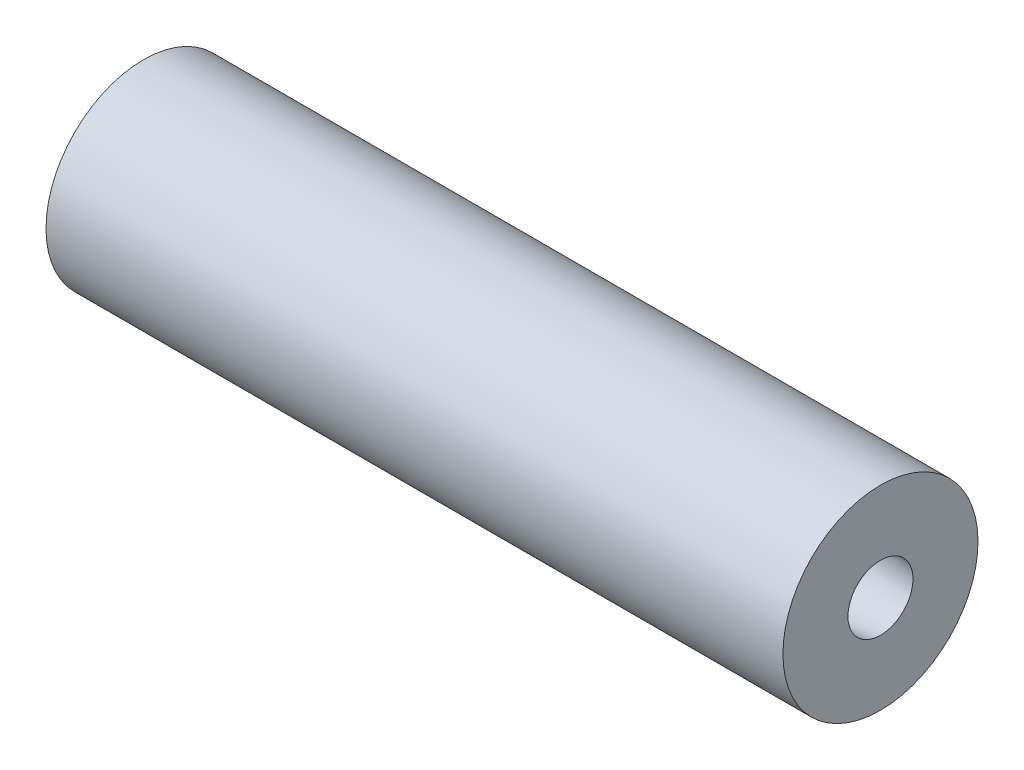
ISO-10303-21;
HEADER;
FILE_DESCRIPTION(('STEP AP214'),'2;1');
FILE_NAME('part.step','',(''),(''),'','','');
FILE_SCHEMA(('AUTOMOTIVE_DESIGN { 1 0 10303 214 1 1 1 1 }'));
ENDSEC;
DATA;
#1=APPLICATION_CONTEXT('core data for automotive mechanical design processes');
#2=APPLICATION_PROTOCOL_DEFINITION('international standard','automotive_design',2000,#1);
#3=PRODUCT_CONTEXT('',#1,'mechanical');
#4=PRODUCT('Part','Part','',(#3));
#5=PRODUCT_RELATED_PRODUCT_CATEGORY('part','',(#4));
#6=PRODUCT_DEFINITION_FORMATION('','',#4);
#7=PRODUCT_DEFINITION_CONTEXT('part definition',#1,'design');
#8=PRODUCT_DEFINITION('design','',#6,#7);
#9=PRODUCT_DEFINITION_SHAPE('','',#8);
#10=(LENGTH_UNIT() NAMED_UNIT(*) SI_UNIT(.MILLI.,.METRE.));
#11=(NAMED_UNIT(*) PLANE_ANGLE_UNIT() SI_UNIT($,.RADIAN.));
#12=(NAMED_UNIT(*) SI_UNIT($,.STERADIAN.) SOLID_ANGLE_UNIT());
#13=UNCERTAINTY_MEASURE_WITH_UNIT(LENGTH_MEASURE(1.E-05),#10,'distance_accuracy_value','');
#14=(GEOMETRIC_REPRESENTATION_CONTEXT(3) GLOBAL_UNCERTAINTY_ASSIGNED_CONTEXT((#13)) GLOBAL_UNIT_ASSIGNED_CONTEXT((#10,
#11,#12)) REPRESENTATION_CONTEXT('',''));
#15=CARTESIAN_POINT('',(0.,0.,0.));
#16=DIRECTION('',(0.,0.,1.));
#17=DIRECTION('',(1.,0.,0.));
#18=AXIS2_PLACEMENT_3D('',#15,#16,#17);
#19=CARTESIAN_POINT('',(0.,8.,0.));
#20=DIRECTION('',(1.,0.,0.));
#21=DIRECTION('',(0.,0.,-1.));
#22=AXIS2_PLACEMENT_3D('',#19,#20,#21);
#23=PLANE('',#22);
#24=CARTESIAN_POINT('',(0.,0.,0.));
#25=DIRECTION('',(-1.,0.,0.));
#26=DIRECTION('',(0.,0.,1.));
#27=AXIS2_PLACEMENT_3D('',#24,#25,#26);
#28=CIRCLE('',#27,8.);
#29=CARTESIAN_POINT('',(0.,0.,8.));
#30=VERTEX_POINT('',#29);
#31=EDGE_CURVE('E45',#30,#30,#28,.T.);
#32=ORIENTED_EDGE('',*,*,#31,.F.);
#33=EDGE_LOOP('',(#32));
#34=FACE_BOUND('',#33,.T.);
#35=CARTESIAN_POINT('',(0.,0.,0.));
#36=DIRECTION('',(-1.,0.,0.));
#37=DIRECTION('',(0.,0.,1.));
#38=AXIS2_PLACEMENT_3D('',#35,#36,#37);
#39=CIRCLE('',#38,9.);
#40=CARTESIAN_POINT('',(0.,0.,9.));
#41=VERTEX_POINT('',#40);
#42=EDGE_CURVE('E10',#41,#41,#39,.T.);
#43=ORIENTED_EDGE('',*,*,#42,.T.);
#44=EDGE_LOOP('',(#43));
#45=FACE_BOUND('',#44,.T.);
#46=ADVANCED_FACE('F31',(#34,#45),#23,.F.);
#47=CARTESIAN_POINT('',(0.,0.,0.));
#48=DIRECTION('',(-1.,0.,0.));
#49=DIRECTION('',(0.,0.,1.));
#50=AXIS2_PLACEMENT_3D('',#47,#48,#49);
#51=CYLINDRICAL_SURFACE('',#50,9.);
#52=ORIENTED_EDGE('',*,*,#42,.F.);
#53=EDGE_LOOP('',(#52));
#54=FACE_BOUND('',#53,.T.);
#55=CARTESIAN_POINT('',(68.,0.,0.));
#56=DIRECTION('',(-1.,0.,0.));
#57=DIRECTION('',(0.,0.,1.));
#58=AXIS2_PLACEMENT_3D('',#55,#56,#57);
#59=CIRCLE('',#58,9.);
#60=CARTESIAN_POINT('',(68.,0.,9.));
#61=VERTEX_POINT('',#60);
#62=EDGE_CURVE('E37',#61,#61,#59,.T.);
#63=ORIENTED_EDGE('',*,*,#62,.T.);
#64=EDGE_LOOP('',(#63));
#65=FACE_BOUND('',#64,.T.);
#66=ADVANCED_FACE('F54',(#54,#65),#51,.T.);
#67=CARTESIAN_POINT('',(68.,9.,0.));
#68=DIRECTION('',(-1.,0.,0.));
#69=DIRECTION('',(0.,0.,1.));
#70=AXIS2_PLACEMENT_3D('',#67,#68,#69);
#71=PLANE('',#70);
#72=ORIENTED_EDGE('',*,*,#62,.F.);
#73=EDGE_LOOP('',(#72));
#74=FACE_BOUND('',#73,.T.);
#75=CARTESIAN_POINT('',(68.,0.,0.));
#76=DIRECTION('',(-1.,0.,0.));
#77=DIRECTION('',(0.,0.,1.));
#78=AXIS2_PLACEMENT_3D('',#75,#76,#77);
#79=CIRCLE('',#78,3.);
#80=CARTESIAN_POINT('',(68.,0.,3.));
#81=VERTEX_POINT('',#80);
#82=EDGE_CURVE('E41',#81,#81,#79,.T.);
#83=ORIENTED_EDGE('',*,*,#82,.T.);
#84=EDGE_LOOP('',(#83));
#85=FACE_BOUND('',#84,.T.);
#86=ADVANCED_FACE('F58',(#74,#85),#71,.F.);
#87=CARTESIAN_POINT('',(0.,0.,0.));
#88=DIRECTION('',(-1.,0.,0.));
#89=DIRECTION('',(0.,0.,1.));
#90=AXIS2_PLACEMENT_3D('',#87,#88,#89);
#91=CONICAL_SURFACE('',#90,8.,0.0733973259016116);
#92=ORIENTED_EDGE('',*,*,#82,.F.);
#93=EDGE_LOOP('',(#92));
#94=FACE_BOUND('',#93,.T.);
#95=ORIENTED_EDGE('',*,*,#31,.T.);
#96=EDGE_LOOP('',(#95));
#97=FACE_BOUND('',#96,.T.);
#98=ADVANCED_FACE('F51',(#94,#97),#91,.F.);
#99=CLOSED_SHELL('',(#46,#66,#86,#98));
#100=MANIFOLD_SOLID_BREP('B2',#99);
#101=ADVANCED_BREP_SHAPE_REPRESENTATION('',(#18,#100),#14);
#102=SHAPE_DEFINITION_REPRESENTATION(#9,#101);
ENDSEC;
END-ISO-10303-21;
